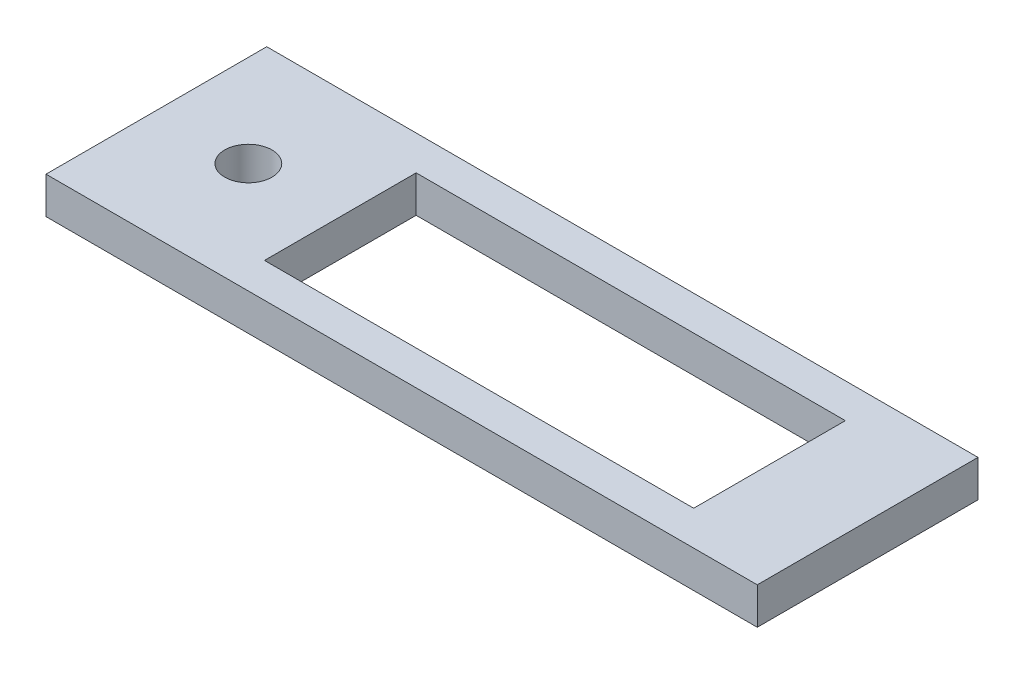
ISO-10303-21;
HEADER;
FILE_DESCRIPTION(('STEP AP214'),'2;1');
FILE_NAME('part.step','',(''),(''),'','','');
FILE_SCHEMA(('AUTOMOTIVE_DESIGN { 1 0 10303 214 1 1 1 1 }'));
ENDSEC;
DATA;
#1=APPLICATION_CONTEXT('core data for automotive mechanical design processes');
#2=APPLICATION_PROTOCOL_DEFINITION('international standard','automotive_design',2000,#1);
#3=PRODUCT_CONTEXT('',#1,'mechanical');
#4=PRODUCT('Part','Part','',(#3));
#5=PRODUCT_RELATED_PRODUCT_CATEGORY('part','',(#4));
#6=PRODUCT_DEFINITION_FORMATION('','',#4);
#7=PRODUCT_DEFINITION_CONTEXT('part definition',#1,'design');
#8=PRODUCT_DEFINITION('design','',#6,#7);
#9=PRODUCT_DEFINITION_SHAPE('','',#8);
#10=(LENGTH_UNIT() NAMED_UNIT(*) SI_UNIT(.MILLI.,.METRE.));
#11=(NAMED_UNIT(*) PLANE_ANGLE_UNIT() SI_UNIT($,.RADIAN.));
#12=(NAMED_UNIT(*) SI_UNIT($,.STERADIAN.) SOLID_ANGLE_UNIT());
#13=UNCERTAINTY_MEASURE_WITH_UNIT(LENGTH_MEASURE(1.E-05),#10,'distance_accuracy_value','');
#14=(GEOMETRIC_REPRESENTATION_CONTEXT(3) GLOBAL_UNCERTAINTY_ASSIGNED_CONTEXT((#13)) GLOBAL_UNIT_ASSIGNED_CONTEXT((#10,
#11,#12)) REPRESENTATION_CONTEXT('',''));
#15=CARTESIAN_POINT('',(0.,0.,0.));
#16=DIRECTION('',(0.,0.,1.));
#17=DIRECTION('',(1.,0.,0.));
#18=AXIS2_PLACEMENT_3D('',#15,#16,#17);
#19=CARTESIAN_POINT('',(0.,3.,0.));
#20=DIRECTION('',(0.,-1.,0.));
#21=DIRECTION('',(0.,0.,-1.));
#22=AXIS2_PLACEMENT_3D('',#19,#20,#21);
#23=PLANE('',#22);
#24=CARTESIAN_POINT('',(-24.0839063223956,3.,0.));
#25=DIRECTION('',(0.,1.,0.));
#26=DIRECTION('',(0.,0.,1.));
#27=AXIS2_PLACEMENT_3D('',#24,#25,#26);
#28=CIRCLE('',#27,1.927548046875);
#29=CARTESIAN_POINT('',(-24.0839063223956,3.,1.927548046875));
#30=VERTEX_POINT('',#29);
#31=EDGE_CURVE('E134',#30,#30,#28,.T.);
#32=ORIENTED_EDGE('',*,*,#31,.F.);
#33=EDGE_LOOP('',(#32));
#34=FACE_BOUND('',#33,.T.);
#35=DIRECTION('',(0.,0.,-1.));
#36=VECTOR('',#35,1.);
#37=CARTESIAN_POINT('',(26.4160936776044,3.,9.));
#38=LINE('',#37,#36);
#39=CARTESIAN_POINT('',(26.4160936776044,3.,9.));
#40=VERTEX_POINT('',#39);
#41=CARTESIAN_POINT('',(26.4160936776044,3.,-9.));
#42=VERTEX_POINT('',#41);
#43=EDGE_CURVE('E140',#40,#42,#38,.T.);
#44=ORIENTED_EDGE('',*,*,#43,.T.);
#45=DIRECTION('',(-1.,0.,0.));
#46=VECTOR('',#45,1.);
#47=CARTESIAN_POINT('',(-31.5839063223956,3.,-9.));
#48=LINE('',#47,#46);
#49=CARTESIAN_POINT('',(-31.5839063223956,3.,-9.));
#50=VERTEX_POINT('',#49);
#51=EDGE_CURVE('E143',#42,#50,#48,.T.);
#52=ORIENTED_EDGE('',*,*,#51,.T.);
#53=DIRECTION('',(0.,0.,1.));
#54=VECTOR('',#53,1.);
#55=CARTESIAN_POINT('',(-31.5839063223956,3.,9.));
#56=LINE('',#55,#54);
#57=CARTESIAN_POINT('',(-31.5839063223956,3.,9.));
#58=VERTEX_POINT('',#57);
#59=EDGE_CURVE('E146',#50,#58,#56,.T.);
#60=ORIENTED_EDGE('',*,*,#59,.T.);
#61=DIRECTION('',(1.,0.,0.));
#62=VECTOR('',#61,1.);
#63=CARTESIAN_POINT('',(-31.5839063223956,3.,9.));
#64=LINE('',#63,#62);
#65=EDGE_CURVE('E148',#58,#40,#64,.T.);
#66=ORIENTED_EDGE('',*,*,#65,.T.);
#67=EDGE_LOOP('',(#44,#52,#60,#66));
#68=FACE_BOUND('',#67,.T.);
#69=DIRECTION('',(0.,0.,-1.));
#70=VECTOR('',#69,1.);
#71=CARTESIAN_POINT('',(18.4160936776044,3.,6.18413503908499));
#72=LINE('',#71,#70);
#73=CARTESIAN_POINT('',(18.4160936776044,3.,6.18413503908499));
#74=VERTEX_POINT('',#73);
#75=CARTESIAN_POINT('',(18.4160936776044,3.,-6.18413503908499));
#76=VERTEX_POINT('',#75);
#77=EDGE_CURVE('E98',#74,#76,#72,.T.);
#78=ORIENTED_EDGE('',*,*,#77,.F.);
#79=DIRECTION('',(1.,0.,0.));
#80=VECTOR('',#79,1.);
#81=CARTESIAN_POINT('',(-16.5839063223956,3.,6.18413503908499));
#82=LINE('',#81,#80);
#83=CARTESIAN_POINT('',(-16.5839063223956,3.,6.18413503908499));
#84=VERTEX_POINT('',#83);
#85=EDGE_CURVE('E120',#84,#74,#82,.T.);
#86=ORIENTED_EDGE('',*,*,#85,.F.);
#87=DIRECTION('',(0.,0.,1.));
#88=VECTOR('',#87,1.);
#89=CARTESIAN_POINT('',(-16.5839063223956,3.,6.18413503908499));
#90=LINE('',#89,#88);
#91=CARTESIAN_POINT('',(-16.5839063223956,3.,-6.18413503908499));
#92=VERTEX_POINT('',#91);
#93=EDGE_CURVE('E118',#92,#84,#90,.T.);
#94=ORIENTED_EDGE('',*,*,#93,.F.);
#95=DIRECTION('',(-1.,0.,0.));
#96=VECTOR('',#95,1.);
#97=CARTESIAN_POINT('',(-16.5839063223956,3.,-6.18413503908499));
#98=LINE('',#97,#96);
#99=EDGE_CURVE('E106',#76,#92,#98,.T.);
#100=ORIENTED_EDGE('',*,*,#99,.F.);
#101=EDGE_LOOP('',(#78,#86,#94,#100));
#102=FACE_BOUND('',#101,.T.);
#103=ADVANCED_FACE('F33',(#34,#68,#102),#23,.F.);
#104=CARTESIAN_POINT('',(0.,0.,0.));
#105=DIRECTION('',(0.,-1.,0.));
#106=DIRECTION('',(0.,0.,-1.));
#107=AXIS2_PLACEMENT_3D('',#104,#105,#106);
#108=PLANE('',#107);
#109=DIRECTION('',(0.,0.,-1.));
#110=VECTOR('',#109,1.);
#111=CARTESIAN_POINT('',(26.4160936776044,0.,9.));
#112=LINE('',#111,#110);
#113=CARTESIAN_POINT('',(26.4160936776044,0.,9.));
#114=VERTEX_POINT('',#113);
#115=CARTESIAN_POINT('',(26.4160936776044,0.,-9.));
#116=VERTEX_POINT('',#115);
#117=EDGE_CURVE('E137',#114,#116,#112,.T.);
#118=ORIENTED_EDGE('',*,*,#117,.F.);
#119=DIRECTION('',(1.,0.,0.));
#120=VECTOR('',#119,1.);
#121=CARTESIAN_POINT('',(-31.5839063223956,0.,9.));
#122=LINE('',#121,#120);
#123=CARTESIAN_POINT('',(-31.5839063223956,0.,9.));
#124=VERTEX_POINT('',#123);
#125=EDGE_CURVE('E144',#124,#114,#122,.T.);
#126=ORIENTED_EDGE('',*,*,#125,.F.);
#127=DIRECTION('',(0.,0.,1.));
#128=VECTOR('',#127,1.);
#129=CARTESIAN_POINT('',(-31.5839063223956,0.,9.));
#130=LINE('',#129,#128);
#131=CARTESIAN_POINT('',(-31.5839063223956,0.,-9.));
#132=VERTEX_POINT('',#131);
#133=EDGE_CURVE('E155',#132,#124,#130,.T.);
#134=ORIENTED_EDGE('',*,*,#133,.F.);
#135=DIRECTION('',(-1.,0.,0.));
#136=VECTOR('',#135,1.);
#137=CARTESIAN_POINT('',(-31.5839063223956,0.,-9.));
#138=LINE('',#137,#136);
#139=EDGE_CURVE('E153',#116,#132,#138,.T.);
#140=ORIENTED_EDGE('',*,*,#139,.F.);
#141=EDGE_LOOP('',(#118,#126,#134,#140));
#142=FACE_BOUND('',#141,.T.);
#143=CARTESIAN_POINT('',(-24.0839063223956,0.,0.));
#144=DIRECTION('',(0.,1.,0.));
#145=DIRECTION('',(0.,0.,1.));
#146=AXIS2_PLACEMENT_3D('',#143,#144,#145);
#147=CIRCLE('',#146,1.927548046875);
#148=CARTESIAN_POINT('',(-24.0839063223956,0.,1.927548046875));
#149=VERTEX_POINT('',#148);
#150=EDGE_CURVE('E114',#149,#149,#147,.T.);
#151=ORIENTED_EDGE('',*,*,#150,.T.);
#152=EDGE_LOOP('',(#151));
#153=FACE_BOUND('',#152,.T.);
#154=DIRECTION('',(1.,0.,0.));
#155=VECTOR('',#154,1.);
#156=CARTESIAN_POINT('',(-16.5839063223956,0.,6.18413503908499));
#157=LINE('',#156,#155);
#158=CARTESIAN_POINT('',(-16.5839063223956,0.,6.18413503908499));
#159=VERTEX_POINT('',#158);
#160=CARTESIAN_POINT('',(18.4160936776044,0.,6.18413503908499));
#161=VERTEX_POINT('',#160);
#162=EDGE_CURVE('E107',#159,#161,#157,.T.);
#163=ORIENTED_EDGE('',*,*,#162,.T.);
#164=DIRECTION('',(0.,0.,-1.));
#165=VECTOR('',#164,1.);
#166=CARTESIAN_POINT('',(18.4160936776044,0.,6.18413503908499));
#167=LINE('',#166,#165);
#168=CARTESIAN_POINT('',(18.4160936776044,0.,-6.18413503908499));
#169=VERTEX_POINT('',#168);
#170=EDGE_CURVE('E56',#161,#169,#167,.T.);
#171=ORIENTED_EDGE('',*,*,#170,.T.);
#172=DIRECTION('',(-1.,0.,0.));
#173=VECTOR('',#172,1.);
#174=CARTESIAN_POINT('',(-16.5839063223956,0.,-6.18413503908499));
#175=LINE('',#174,#173);
#176=CARTESIAN_POINT('',(-16.5839063223956,0.,-6.18413503908499));
#177=VERTEX_POINT('',#176);
#178=EDGE_CURVE('E113',#169,#177,#175,.T.);
#179=ORIENTED_EDGE('',*,*,#178,.T.);
#180=DIRECTION('',(0.,0.,1.));
#181=VECTOR('',#180,1.);
#182=CARTESIAN_POINT('',(-16.5839063223956,0.,6.18413503908499));
#183=LINE('',#182,#181);
#184=EDGE_CURVE('E126',#177,#159,#183,.T.);
#185=ORIENTED_EDGE('',*,*,#184,.T.);
#186=EDGE_LOOP('',(#163,#171,#179,#185));
#187=FACE_BOUND('',#186,.T.);
#188=ADVANCED_FACE('F173',(#142,#153,#187),#108,.T.);
#189=CARTESIAN_POINT('',(26.4160936776044,3.,9.));
#190=DIRECTION('',(-1.,0.,0.));
#191=DIRECTION('',(0.,0.,1.));
#192=AXIS2_PLACEMENT_3D('',#189,#190,#191);
#193=PLANE('',#192);
#194=ORIENTED_EDGE('',*,*,#117,.T.);
#195=DIRECTION('',(0.,-1.,0.));
#196=VECTOR('',#195,1.);
#197=CARTESIAN_POINT('',(26.4160936776044,3.,-9.));
#198=LINE('',#197,#196);
#199=EDGE_CURVE('E11',#42,#116,#198,.T.);
#200=ORIENTED_EDGE('',*,*,#199,.F.);
#201=ORIENTED_EDGE('',*,*,#43,.F.);
#202=DIRECTION('',(0.,-1.,0.));
#203=VECTOR('',#202,1.);
#204=CARTESIAN_POINT('',(26.4160936776044,3.,9.));
#205=LINE('',#204,#203);
#206=EDGE_CURVE('E150',#40,#114,#205,.T.);
#207=ORIENTED_EDGE('',*,*,#206,.T.);
#208=EDGE_LOOP('',(#194,#200,#201,#207));
#209=FACE_BOUND('',#208,.T.);
#210=ADVANCED_FACE('F35',(#209),#193,.F.);
#211=CARTESIAN_POINT('',(-31.5839063223956,3.,-9.));
#212=DIRECTION('',(0.,0.,1.));
#213=DIRECTION('',(1.,0.,0.));
#214=AXIS2_PLACEMENT_3D('',#211,#212,#213);
#215=PLANE('',#214);
#216=ORIENTED_EDGE('',*,*,#139,.T.);
#217=DIRECTION('',(0.,-1.,0.));
#218=VECTOR('',#217,1.);
#219=CARTESIAN_POINT('',(-31.5839063223956,3.,-9.));
#220=LINE('',#219,#218);
#221=EDGE_CURVE('E41',#50,#132,#220,.T.);
#222=ORIENTED_EDGE('',*,*,#221,.F.);
#223=ORIENTED_EDGE('',*,*,#51,.F.);
#224=ORIENTED_EDGE('',*,*,#199,.T.);
#225=EDGE_LOOP('',(#216,#222,#223,#224));
#226=FACE_BOUND('',#225,.T.);
#227=ADVANCED_FACE('F183',(#226),#215,.F.);
#228=CARTESIAN_POINT('',(-31.5839063223956,3.,9.));
#229=DIRECTION('',(1.,0.,0.));
#230=DIRECTION('',(0.,0.,-1.));
#231=AXIS2_PLACEMENT_3D('',#228,#229,#230);
#232=PLANE('',#231);
#233=ORIENTED_EDGE('',*,*,#133,.T.);
#234=DIRECTION('',(0.,-1.,0.));
#235=VECTOR('',#234,1.);
#236=CARTESIAN_POINT('',(-31.5839063223956,3.,9.));
#237=LINE('',#236,#235);
#238=EDGE_CURVE('E160',#58,#124,#237,.T.);
#239=ORIENTED_EDGE('',*,*,#238,.F.);
#240=ORIENTED_EDGE('',*,*,#59,.F.);
#241=ORIENTED_EDGE('',*,*,#221,.T.);
#242=EDGE_LOOP('',(#233,#239,#240,#241));
#243=FACE_BOUND('',#242,.T.);
#244=ADVANCED_FACE('F167',(#243),#232,.F.);
#245=CARTESIAN_POINT('',(-31.5839063223956,3.,9.));
#246=DIRECTION('',(0.,0.,-1.));
#247=DIRECTION('',(-1.,0.,0.));
#248=AXIS2_PLACEMENT_3D('',#245,#246,#247);
#249=PLANE('',#248);
#250=ORIENTED_EDGE('',*,*,#125,.T.);
#251=ORIENTED_EDGE('',*,*,#206,.F.);
#252=ORIENTED_EDGE('',*,*,#65,.F.);
#253=ORIENTED_EDGE('',*,*,#238,.T.);
#254=EDGE_LOOP('',(#250,#251,#252,#253));
#255=FACE_BOUND('',#254,.T.);
#256=ADVANCED_FACE('F177',(#255),#249,.F.);
#257=CARTESIAN_POINT('',(-24.0839063223956,3.,0.));
#258=DIRECTION('',(0.,-1.,0.));
#259=DIRECTION('',(0.,0.,-1.));
#260=AXIS2_PLACEMENT_3D('',#257,#258,#259);
#261=CYLINDRICAL_SURFACE('',#260,1.927548046875);
#262=ORIENTED_EDGE('',*,*,#31,.T.);
#263=EDGE_LOOP('',(#262));
#264=FACE_BOUND('',#263,.T.);
#265=ORIENTED_EDGE('',*,*,#150,.F.);
#266=EDGE_LOOP('',(#265));
#267=FACE_BOUND('',#266,.T.);
#268=ADVANCED_FACE('F199',(#264,#267),#261,.F.);
#269=CARTESIAN_POINT('',(18.4160936776044,3.,6.18413503908499));
#270=DIRECTION('',(-1.,0.,0.));
#271=DIRECTION('',(0.,0.,1.));
#272=AXIS2_PLACEMENT_3D('',#269,#270,#271);
#273=PLANE('',#272);
#274=ORIENTED_EDGE('',*,*,#170,.F.);
#275=DIRECTION('',(0.,-1.,0.));
#276=VECTOR('',#275,1.);
#277=CARTESIAN_POINT('',(18.4160936776044,3.,6.18413503908499));
#278=LINE('',#277,#276);
#279=EDGE_CURVE('E102',#74,#161,#278,.T.);
#280=ORIENTED_EDGE('',*,*,#279,.F.);
#281=ORIENTED_EDGE('',*,*,#77,.T.);
#282=DIRECTION('',(0.,-1.,0.));
#283=VECTOR('',#282,1.);
#284=CARTESIAN_POINT('',(18.4160936776044,3.,-6.18413503908499));
#285=LINE('',#284,#283);
#286=EDGE_CURVE('E101',#76,#169,#285,.T.);
#287=ORIENTED_EDGE('',*,*,#286,.T.);
#288=EDGE_LOOP('',(#274,#280,#281,#287));
#289=FACE_BOUND('',#288,.T.);
#290=ADVANCED_FACE('F100',(#289),#273,.T.);
#291=CARTESIAN_POINT('',(-16.5839063223956,3.,-6.18413503908499));
#292=DIRECTION('',(0.,0.,1.));
#293=DIRECTION('',(1.,0.,0.));
#294=AXIS2_PLACEMENT_3D('',#291,#292,#293);
#295=PLANE('',#294);
#296=ORIENTED_EDGE('',*,*,#178,.F.);
#297=ORIENTED_EDGE('',*,*,#286,.F.);
#298=ORIENTED_EDGE('',*,*,#99,.T.);
#299=DIRECTION('',(0.,-1.,0.));
#300=VECTOR('',#299,1.);
#301=CARTESIAN_POINT('',(-16.5839063223956,3.,-6.18413503908499));
#302=LINE('',#301,#300);
#303=EDGE_CURVE('E115',#92,#177,#302,.T.);
#304=ORIENTED_EDGE('',*,*,#303,.T.);
#305=EDGE_LOOP('',(#296,#297,#298,#304));
#306=FACE_BOUND('',#305,.T.);
#307=ADVANCED_FACE('F110',(#306),#295,.T.);
#308=CARTESIAN_POINT('',(-16.5839063223956,3.,6.18413503908499));
#309=DIRECTION('',(1.,0.,0.));
#310=DIRECTION('',(0.,0.,-1.));
#311=AXIS2_PLACEMENT_3D('',#308,#309,#310);
#312=PLANE('',#311);
#313=ORIENTED_EDGE('',*,*,#184,.F.);
#314=ORIENTED_EDGE('',*,*,#303,.F.);
#315=ORIENTED_EDGE('',*,*,#93,.T.);
#316=DIRECTION('',(0.,-1.,0.));
#317=VECTOR('',#316,1.);
#318=CARTESIAN_POINT('',(-16.5839063223956,3.,6.18413503908499));
#319=LINE('',#318,#317);
#320=EDGE_CURVE('E48',#84,#159,#319,.T.);
#321=ORIENTED_EDGE('',*,*,#320,.T.);
#322=EDGE_LOOP('',(#313,#314,#315,#321));
#323=FACE_BOUND('',#322,.T.);
#324=ADVANCED_FACE('F216',(#323),#312,.T.);
#325=CARTESIAN_POINT('',(-16.5839063223956,3.,6.18413503908499));
#326=DIRECTION('',(0.,0.,-1.));
#327=DIRECTION('',(-1.,0.,0.));
#328=AXIS2_PLACEMENT_3D('',#325,#326,#327);
#329=PLANE('',#328);
#330=ORIENTED_EDGE('',*,*,#162,.F.);
#331=ORIENTED_EDGE('',*,*,#320,.F.);
#332=ORIENTED_EDGE('',*,*,#85,.T.);
#333=ORIENTED_EDGE('',*,*,#279,.T.);
#334=EDGE_LOOP('',(#330,#331,#332,#333));
#335=FACE_BOUND('',#334,.T.);
#336=ADVANCED_FACE('F214',(#335),#329,.T.);
#337=CLOSED_SHELL('',(#103,#188,#210,#227,#244,#256,#268,#290,#307,#324,#336));
#338=MANIFOLD_SOLID_BREP('B2',#337);
#339=ADVANCED_BREP_SHAPE_REPRESENTATION('',(#18,#338),#14);
#340=SHAPE_DEFINITION_REPRESENTATION(#9,#339);
ENDSEC;
END-ISO-10303-21;
